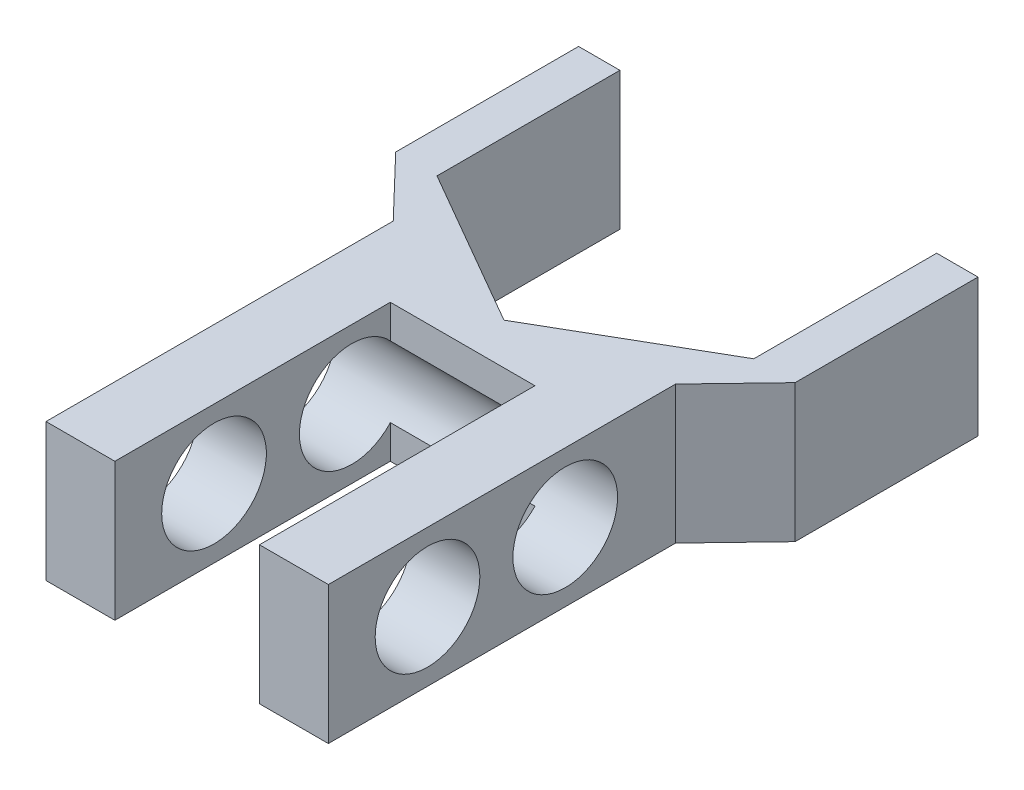
ISO-10303-21;
HEADER;
FILE_DESCRIPTION(('STEP AP214'),'2;1');
FILE_NAME('part.step','',(''),(''),'','','');
FILE_SCHEMA(('AUTOMOTIVE_DESIGN { 1 0 10303 214 1 1 1 1 }'));
ENDSEC;
DATA;
#1=APPLICATION_CONTEXT('core data for automotive mechanical design processes');
#2=APPLICATION_PROTOCOL_DEFINITION('international standard','automotive_design',2000,#1);
#3=PRODUCT_CONTEXT('',#1,'mechanical');
#4=PRODUCT('Part','Part','',(#3));
#5=PRODUCT_RELATED_PRODUCT_CATEGORY('part','',(#4));
#6=PRODUCT_DEFINITION_FORMATION('','',#4);
#7=PRODUCT_DEFINITION_CONTEXT('part definition',#1,'design');
#8=PRODUCT_DEFINITION('design','',#6,#7);
#9=PRODUCT_DEFINITION_SHAPE('','',#8);
#10=(LENGTH_UNIT() NAMED_UNIT(*) SI_UNIT(.MILLI.,.METRE.));
#11=(NAMED_UNIT(*) PLANE_ANGLE_UNIT() SI_UNIT($,.RADIAN.));
#12=(NAMED_UNIT(*) SI_UNIT($,.STERADIAN.) SOLID_ANGLE_UNIT());
#13=UNCERTAINTY_MEASURE_WITH_UNIT(LENGTH_MEASURE(1.E-05),#10,'distance_accuracy_value','');
#14=(GEOMETRIC_REPRESENTATION_CONTEXT(3) GLOBAL_UNCERTAINTY_ASSIGNED_CONTEXT((#13)) GLOBAL_UNIT_ASSIGNED_CONTEXT((#10,
#11,#12)) REPRESENTATION_CONTEXT('',''));
#15=CARTESIAN_POINT('',(0.,0.,0.));
#16=DIRECTION('',(0.,0.,1.));
#17=DIRECTION('',(1.,0.,0.));
#18=AXIS2_PLACEMENT_3D('',#15,#16,#17);
#19=CARTESIAN_POINT('',(0.,10.,16.2790561913614));
#20=DIRECTION('',(0.,0.,-1.));
#21=DIRECTION('',(-1.,0.,0.));
#22=AXIS2_PLACEMENT_3D('',#19,#20,#21);
#23=PLANE('',#22);
#24=DIRECTION('',(0.,-1.,0.));
#25=VECTOR('',#24,1.);
#26=CARTESIAN_POINT('',(5.25,10.,16.2790561913614));
#27=LINE('',#26,#25);
#28=CARTESIAN_POINT('',(5.25,2.43095348426698,16.2790561913614));
#29=VERTEX_POINT('',#28);
#30=CARTESIAN_POINT('',(5.25,0.,16.2790561913614));
#31=VERTEX_POINT('',#30);
#32=EDGE_CURVE('E297',#29,#31,#27,.T.);
#33=ORIENTED_EDGE('',*,*,#32,.F.);
#34=DIRECTION('',(-1.,0.,0.));
#35=VECTOR('',#34,1.);
#36=CARTESIAN_POINT('',(14.5,2.43095348426698,16.2790561913614));
#37=LINE('',#36,#35);
#38=CARTESIAN_POINT('',(-5.25,2.43095348426698,16.2790561913614));
#39=VERTEX_POINT('',#38);
#40=EDGE_CURVE('E65',#29,#39,#37,.T.);
#41=ORIENTED_EDGE('',*,*,#40,.T.);
#42=DIRECTION('',(0.,-1.,0.));
#43=VECTOR('',#42,1.);
#44=CARTESIAN_POINT('',(-5.25,10.,16.2790561913614));
#45=LINE('',#44,#43);
#46=CARTESIAN_POINT('',(-5.25,0.,16.2790561913614));
#47=VERTEX_POINT('',#46);
#48=EDGE_CURVE('E302',#39,#47,#45,.T.);
#49=ORIENTED_EDGE('',*,*,#48,.T.);
#50=DIRECTION('',(1.,0.,0.));
#51=VECTOR('',#50,1.);
#52=CARTESIAN_POINT('',(0.,0.,16.2790561913614));
#53=LINE('',#52,#51);
#54=EDGE_CURVE('E238',#47,#31,#53,.T.);
#55=ORIENTED_EDGE('',*,*,#54,.T.);
#56=EDGE_LOOP('',(#33,#41,#49,#55));
#57=FACE_BOUND('',#56,.T.);
#58=ADVANCED_FACE('F47',(#57),#23,.F.);
#59=CARTESIAN_POINT('',(-11.5,10.,0.));
#60=DIRECTION('',(1.,0.,0.));
#61=DIRECTION('',(0.,0.,-1.));
#62=AXIS2_PLACEMENT_3D('',#59,#60,#61);
#63=PLANE('',#62);
#64=DIRECTION('',(0.,0.,1.));
#65=VECTOR('',#64,1.);
#66=CARTESIAN_POINT('',(-11.5,0.,0.));
#67=LINE('',#66,#65);
#68=CARTESIAN_POINT('',(-11.5,0.,-6.63952809568069));
#69=VERTEX_POINT('',#68);
#70=CARTESIAN_POINT('',(-11.5,0.,6.6395280956807));
#71=VERTEX_POINT('',#70);
#72=EDGE_CURVE('E215',#69,#71,#67,.T.);
#73=ORIENTED_EDGE('',*,*,#72,.F.);
#74=DIRECTION('',(0.,-1.,0.));
#75=VECTOR('',#74,1.);
#76=CARTESIAN_POINT('',(-11.5,10.,-6.63952809568069));
#77=LINE('',#76,#75);
#78=CARTESIAN_POINT('',(-11.5,10.,-6.63952809568069));
#79=VERTEX_POINT('',#78);
#80=EDGE_CURVE('E11',#79,#69,#77,.T.);
#81=ORIENTED_EDGE('',*,*,#80,.F.);
#82=DIRECTION('',(0.,0.,1.));
#83=VECTOR('',#82,1.);
#84=CARTESIAN_POINT('',(-11.5,10.,0.));
#85=LINE('',#84,#83);
#86=CARTESIAN_POINT('',(-11.5,10.,6.6395280956807));
#87=VERTEX_POINT('',#86);
#88=EDGE_CURVE('E275',#79,#87,#85,.T.);
#89=ORIENTED_EDGE('',*,*,#88,.T.);
#90=DIRECTION('',(0.,-1.,0.));
#91=VECTOR('',#90,1.);
#92=CARTESIAN_POINT('',(-11.5,10.,6.6395280956807));
#93=LINE('',#92,#91);
#94=EDGE_CURVE('E74',#87,#71,#93,.T.);
#95=ORIENTED_EDGE('',*,*,#94,.T.);
#96=EDGE_LOOP('',(#73,#81,#89,#95));
#97=FACE_BOUND('',#96,.T.);
#98=ADVANCED_FACE('F49',(#97),#63,.T.);
#99=CARTESIAN_POINT('',(0.,10.,-6.63952809568067));
#100=DIRECTION('',(0.,0.,1.));
#101=DIRECTION('',(1.,0.,0.));
#102=AXIS2_PLACEMENT_3D('',#99,#100,#101);
#103=PLANE('',#102);
#104=DIRECTION('',(-1.,0.,0.));
#105=VECTOR('',#104,1.);
#106=CARTESIAN_POINT('',(0.,0.,-6.63952809568067));
#107=LINE('',#106,#105);
#108=CARTESIAN_POINT('',(-14.5,0.,-6.63952809568069));
#109=VERTEX_POINT('',#108);
#110=EDGE_CURVE('E218',#69,#109,#107,.T.);
#111=ORIENTED_EDGE('',*,*,#110,.T.);
#112=DIRECTION('',(0.,-1.,0.));
#113=VECTOR('',#112,1.);
#114=CARTESIAN_POINT('',(-14.5,10.,-6.63952809568069));
#115=LINE('',#114,#113);
#116=CARTESIAN_POINT('',(-14.5,10.,-6.63952809568069));
#117=VERTEX_POINT('',#116);
#118=EDGE_CURVE('E57',#117,#109,#115,.T.);
#119=ORIENTED_EDGE('',*,*,#118,.F.);
#120=DIRECTION('',(-1.,0.,0.));
#121=VECTOR('',#120,1.);
#122=CARTESIAN_POINT('',(0.,10.,-6.63952809568067));
#123=LINE('',#122,#121);
#124=EDGE_CURVE('E363',#79,#117,#123,.T.);
#125=ORIENTED_EDGE('',*,*,#124,.F.);
#126=ORIENTED_EDGE('',*,*,#80,.T.);
#127=EDGE_LOOP('',(#111,#119,#125,#126));
#128=FACE_BOUND('',#127,.T.);
#129=ADVANCED_FACE('F413',(#128),#103,.F.);
#130=CARTESIAN_POINT('',(-14.5,10.,0.));
#131=DIRECTION('',(1.,0.,0.));
#132=DIRECTION('',(0.,0.,-1.));
#133=AXIS2_PLACEMENT_3D('',#130,#131,#132);
#134=PLANE('',#133);
#135=DIRECTION('',(0.,0.,1.));
#136=VECTOR('',#135,1.);
#137=CARTESIAN_POINT('',(-14.5,0.,0.));
#138=LINE('',#137,#136);
#139=CARTESIAN_POINT('',(-14.5,0.,6.6395280956807));
#140=VERTEX_POINT('',#139);
#141=EDGE_CURVE('E222',#109,#140,#138,.T.);
#142=ORIENTED_EDGE('',*,*,#141,.T.);
#143=DIRECTION('',(0.,-1.,0.));
#144=VECTOR('',#143,1.);
#145=CARTESIAN_POINT('',(-14.5,10.,6.6395280956807));
#146=LINE('',#145,#144);
#147=CARTESIAN_POINT('',(-14.5,10.,6.6395280956807));
#148=VERTEX_POINT('',#147);
#149=EDGE_CURVE('E319',#148,#140,#146,.T.);
#150=ORIENTED_EDGE('',*,*,#149,.F.);
#151=DIRECTION('',(0.,0.,1.));
#152=VECTOR('',#151,1.);
#153=CARTESIAN_POINT('',(-14.5,10.,0.));
#154=LINE('',#153,#152);
#155=EDGE_CURVE('E366',#117,#148,#154,.T.);
#156=ORIENTED_EDGE('',*,*,#155,.F.);
#157=ORIENTED_EDGE('',*,*,#118,.T.);
#158=EDGE_LOOP('',(#142,#150,#156,#157));
#159=FACE_BOUND('',#158,.T.);
#160=ADVANCED_FACE('F417',(#159),#134,.F.);
#161=CARTESIAN_POINT('',(-10.8658247279593,10.,10.4267426512985));
#162=DIRECTION('',(0.721534900393805,0.,-0.692378066892433));
#163=DIRECTION('',(-0.692378066892433,0.,-0.721534900393805));
#164=AXIS2_PLACEMENT_3D('',#161,#162,#163);
#165=PLANE('',#164);
#166=DIRECTION('',(0.692378066892433,0.,0.721534900393805));
#167=VECTOR('',#166,1.);
#168=CARTESIAN_POINT('',(-10.8658247279593,0.,10.4267426512985));
#169=LINE('',#168,#167);
#170=CARTESIAN_POINT('',(-10.25,0.,11.0685004639664));
#171=VERTEX_POINT('',#170);
#172=EDGE_CURVE('E225',#140,#171,#169,.T.);
#173=ORIENTED_EDGE('',*,*,#172,.T.);
#174=DIRECTION('',(0.,-1.,0.));
#175=VECTOR('',#174,1.);
#176=CARTESIAN_POINT('',(-10.25,10.,11.0685004639664));
#177=LINE('',#176,#175);
#178=CARTESIAN_POINT('',(-10.25,10.,11.0685004639664));
#179=VERTEX_POINT('',#178);
#180=EDGE_CURVE('E315',#179,#171,#177,.T.);
#181=ORIENTED_EDGE('',*,*,#180,.F.);
#182=DIRECTION('',(0.692378066892433,0.,0.721534900393805));
#183=VECTOR('',#182,1.);
#184=CARTESIAN_POINT('',(-10.8658247279593,10.,10.4267426512985));
#185=LINE('',#184,#183);
#186=EDGE_CURVE('E369',#148,#179,#185,.T.);
#187=ORIENTED_EDGE('',*,*,#186,.F.);
#188=ORIENTED_EDGE('',*,*,#149,.T.);
#189=EDGE_LOOP('',(#173,#181,#187,#188));
#190=FACE_BOUND('',#189,.T.);
#191=ADVANCED_FACE('F487',(#190),#165,.F.);
#192=CARTESIAN_POINT('',(-10.25,10.,0.));
#193=DIRECTION('',(1.,0.,0.));
#194=DIRECTION('',(0.,0.,-1.));
#195=AXIS2_PLACEMENT_3D('',#192,#193,#194);
#196=PLANE('',#195);
#197=CARTESIAN_POINT('',(-10.25,5.,19.0790561913614));
#198=DIRECTION('',(-1.,0.,0.));
#199=DIRECTION('',(0.,0.,1.));
#200=AXIS2_PLACEMENT_3D('',#197,#198,#199);
#201=CIRCLE('',#200,3.8);
#202=CARTESIAN_POINT('',(-10.25,5.,22.8790561913614));
#203=VERTEX_POINT('',#202);
#204=EDGE_CURVE('E329',#203,#203,#201,.T.);
#205=ORIENTED_EDGE('',*,*,#204,.F.);
#206=EDGE_LOOP('',(#205));
#207=FACE_BOUND('',#206,.T.);
#208=CARTESIAN_POINT('',(-10.25,5.,29.0790561913614));
#209=DIRECTION('',(-1.,0.,0.));
#210=DIRECTION('',(0.,0.,1.));
#211=AXIS2_PLACEMENT_3D('',#208,#209,#210);
#212=CIRCLE('',#211,3.8);
#213=CARTESIAN_POINT('',(-10.25,5.,32.8790561913614));
#214=VERTEX_POINT('',#213);
#215=EDGE_CURVE('E338',#214,#214,#212,.T.);
#216=ORIENTED_EDGE('',*,*,#215,.F.);
#217=EDGE_LOOP('',(#216));
#218=FACE_BOUND('',#217,.T.);
#219=DIRECTION('',(0.,0.,1.));
#220=VECTOR('',#219,1.);
#221=CARTESIAN_POINT('',(-10.25,0.,0.));
#222=LINE('',#221,#220);
#223=CARTESIAN_POINT('',(-10.25,0.,36.2790561913614));
#224=VERTEX_POINT('',#223);
#225=EDGE_CURVE('E228',#171,#224,#222,.T.);
#226=ORIENTED_EDGE('',*,*,#225,.T.);
#227=DIRECTION('',(0.,-1.,0.));
#228=VECTOR('',#227,1.);
#229=CARTESIAN_POINT('',(-10.25,10.,36.2790561913614));
#230=LINE('',#229,#228);
#231=CARTESIAN_POINT('',(-10.25,10.,36.2790561913614));
#232=VERTEX_POINT('',#231);
#233=EDGE_CURVE('E311',#232,#224,#230,.T.);
#234=ORIENTED_EDGE('',*,*,#233,.F.);
#235=DIRECTION('',(0.,0.,1.));
#236=VECTOR('',#235,1.);
#237=CARTESIAN_POINT('',(-10.25,10.,0.));
#238=LINE('',#237,#236);
#239=EDGE_CURVE('E372',#179,#232,#238,.T.);
#240=ORIENTED_EDGE('',*,*,#239,.F.);
#241=ORIENTED_EDGE('',*,*,#180,.T.);
#242=EDGE_LOOP('',(#226,#234,#240,#241));
#243=FACE_BOUND('',#242,.T.);
#244=ADVANCED_FACE('F482',(#207,#218,#243),#196,.F.);
#245=CARTESIAN_POINT('',(0.,10.,36.2790561913614));
#246=DIRECTION('',(0.,0.,-1.));
#247=DIRECTION('',(-1.,0.,0.));
#248=AXIS2_PLACEMENT_3D('',#245,#246,#247);
#249=PLANE('',#248);
#250=DIRECTION('',(1.,0.,0.));
#251=VECTOR('',#250,1.);
#252=CARTESIAN_POINT('',(0.,0.,36.2790561913614));
#253=LINE('',#252,#251);
#254=CARTESIAN_POINT('',(-5.25,0.,36.2790561913614));
#255=VERTEX_POINT('',#254);
#256=EDGE_CURVE('E231',#224,#255,#253,.T.);
#257=ORIENTED_EDGE('',*,*,#256,.T.);
#258=DIRECTION('',(0.,-1.,0.));
#259=VECTOR('',#258,1.);
#260=CARTESIAN_POINT('',(-5.25,10.,36.2790561913614));
#261=LINE('',#260,#259);
#262=CARTESIAN_POINT('',(-5.25,10.,36.2790561913614));
#263=VERTEX_POINT('',#262);
#264=EDGE_CURVE('E307',#263,#255,#261,.T.);
#265=ORIENTED_EDGE('',*,*,#264,.F.);
#266=DIRECTION('',(1.,0.,0.));
#267=VECTOR('',#266,1.);
#268=CARTESIAN_POINT('',(0.,10.,36.2790561913614));
#269=LINE('',#268,#267);
#270=EDGE_CURVE('E375',#232,#263,#269,.T.);
#271=ORIENTED_EDGE('',*,*,#270,.F.);
#272=ORIENTED_EDGE('',*,*,#233,.T.);
#273=EDGE_LOOP('',(#257,#265,#271,#272));
#274=FACE_BOUND('',#273,.T.);
#275=ADVANCED_FACE('F440',(#274),#249,.F.);
#276=CARTESIAN_POINT('',(-5.25,10.,0.));
#277=DIRECTION('',(-1.,0.,0.));
#278=DIRECTION('',(0.,0.,1.));
#279=AXIS2_PLACEMENT_3D('',#276,#277,#278);
#280=PLANE('',#279);
#281=CARTESIAN_POINT('',(-5.25,5.,29.0790561913614));
#282=DIRECTION('',(-1.,0.,0.));
#283=DIRECTION('',(0.,0.,1.));
#284=AXIS2_PLACEMENT_3D('',#281,#282,#283);
#285=CIRCLE('',#284,3.8);
#286=CARTESIAN_POINT('',(-5.25,5.,32.8790561913614));
#287=VERTEX_POINT('',#286);
#288=EDGE_CURVE('E335',#287,#287,#285,.T.);
#289=ORIENTED_EDGE('',*,*,#288,.T.);
#290=EDGE_LOOP('',(#289));
#291=FACE_BOUND('',#290,.T.);
#292=ORIENTED_EDGE('',*,*,#48,.F.);
#293=CARTESIAN_POINT('',(-5.25,5.,19.0790561913614));
#294=DIRECTION('',(-1.,0.,0.));
#295=DIRECTION('',(0.,0.,1.));
#296=AXIS2_PLACEMENT_3D('',#293,#294,#295);
#297=CIRCLE('',#296,3.8);
#298=CARTESIAN_POINT('',(-5.25,7.56904651573303,16.2790561913614));
#299=VERTEX_POINT('',#298);
#300=EDGE_CURVE('E219',#39,#299,#297,.T.);
#301=ORIENTED_EDGE('',*,*,#300,.T.);
#302=CARTESIAN_POINT('',(-5.25,10.,16.2790561913614));
#303=VERTEX_POINT('',#302);
#304=EDGE_CURVE('E303',#303,#299,#45,.T.);
#305=ORIENTED_EDGE('',*,*,#304,.F.);
#306=DIRECTION('',(0.,0.,-1.));
#307=VECTOR('',#306,1.);
#308=CARTESIAN_POINT('',(-5.25,10.,0.));
#309=LINE('',#308,#307);
#310=EDGE_CURVE('E378',#263,#303,#309,.T.);
#311=ORIENTED_EDGE('',*,*,#310,.F.);
#312=ORIENTED_EDGE('',*,*,#264,.T.);
#313=DIRECTION('',(0.,0.,-1.));
#314=VECTOR('',#313,1.);
#315=CARTESIAN_POINT('',(-5.25,0.,0.));
#316=LINE('',#315,#314);
#317=EDGE_CURVE('E234',#255,#47,#316,.T.);
#318=ORIENTED_EDGE('',*,*,#317,.T.);
#319=EDGE_LOOP('',(#292,#301,#305,#311,#312,#318));
#320=FACE_BOUND('',#319,.T.);
#321=ADVANCED_FACE('F432',(#291,#320),#280,.F.);
#322=ORIENTED_EDGE('',*,*,#304,.T.);
#323=DIRECTION('',(-1.,0.,0.));
#324=VECTOR('',#323,1.);
#325=CARTESIAN_POINT('',(14.5,7.56904651573303,16.2790561913614));
#326=LINE('',#325,#324);
#327=CARTESIAN_POINT('',(5.25,7.56904651573303,16.2790561913614));
#328=VERTEX_POINT('',#327);
#329=EDGE_CURVE('E352',#299,#328,#326,.F.);
#330=ORIENTED_EDGE('',*,*,#329,.T.);
#331=CARTESIAN_POINT('',(5.25,10.,16.2790561913614));
#332=VERTEX_POINT('',#331);
#333=EDGE_CURVE('E298',#332,#328,#27,.T.);
#334=ORIENTED_EDGE('',*,*,#333,.F.);
#335=DIRECTION('',(1.,0.,0.));
#336=VECTOR('',#335,1.);
#337=CARTESIAN_POINT('',(0.,10.,16.2790561913614));
#338=LINE('',#337,#336);
#339=EDGE_CURVE('E381',#303,#332,#338,.T.);
#340=ORIENTED_EDGE('',*,*,#339,.F.);
#341=EDGE_LOOP('',(#322,#330,#334,#340));
#342=FACE_BOUND('',#341,.T.);
#343=ADVANCED_FACE('F422',(#342),#23,.F.);
#344=CARTESIAN_POINT('',(5.25,10.,0.));
#345=DIRECTION('',(-1.,0.,0.));
#346=DIRECTION('',(0.,0.,1.));
#347=AXIS2_PLACEMENT_3D('',#344,#345,#346);
#348=PLANE('',#347);
#349=CARTESIAN_POINT('',(5.25,5.,19.0790561913614));
#350=DIRECTION('',(-1.,0.,0.));
#351=DIRECTION('',(0.,0.,1.));
#352=AXIS2_PLACEMENT_3D('',#349,#350,#351);
#353=CIRCLE('',#352,3.8);
#354=EDGE_CURVE('E349',#29,#328,#353,.T.);
#355=ORIENTED_EDGE('',*,*,#354,.F.);
#356=ORIENTED_EDGE('',*,*,#32,.T.);
#357=DIRECTION('',(0.,0.,-1.));
#358=VECTOR('',#357,1.);
#359=CARTESIAN_POINT('',(5.25,0.,0.));
#360=LINE('',#359,#358);
#361=CARTESIAN_POINT('',(5.25,0.,36.2790561913614));
#362=VERTEX_POINT('',#361);
#363=EDGE_CURVE('E242',#362,#31,#360,.T.);
#364=ORIENTED_EDGE('',*,*,#363,.F.);
#365=DIRECTION('',(0.,-1.,0.));
#366=VECTOR('',#365,1.);
#367=CARTESIAN_POINT('',(5.25,10.,36.2790561913614));
#368=LINE('',#367,#366);
#369=CARTESIAN_POINT('',(5.25,10.,36.2790561913614));
#370=VERTEX_POINT('',#369);
#371=EDGE_CURVE('E294',#370,#362,#368,.T.);
#372=ORIENTED_EDGE('',*,*,#371,.F.);
#373=DIRECTION('',(0.,0.,-1.));
#374=VECTOR('',#373,1.);
#375=CARTESIAN_POINT('',(5.25,10.,0.));
#376=LINE('',#375,#374);
#377=EDGE_CURVE('E384',#370,#332,#376,.T.);
#378=ORIENTED_EDGE('',*,*,#377,.T.);
#379=ORIENTED_EDGE('',*,*,#333,.T.);
#380=EDGE_LOOP('',(#355,#356,#364,#372,#378,#379));
#381=FACE_BOUND('',#380,.T.);
#382=CARTESIAN_POINT('',(5.25,5.,29.0790561913614));
#383=DIRECTION('',(-1.,0.,0.));
#384=DIRECTION('',(0.,0.,1.));
#385=AXIS2_PLACEMENT_3D('',#382,#383,#384);
#386=CIRCLE('',#385,3.8);
#387=CARTESIAN_POINT('',(5.25,5.,32.8790561913614));
#388=VERTEX_POINT('',#387);
#389=EDGE_CURVE('E328',#388,#388,#386,.T.);
#390=ORIENTED_EDGE('',*,*,#389,.F.);
#391=EDGE_LOOP('',(#390));
#392=FACE_BOUND('',#391,.T.);
#393=ADVANCED_FACE('F431',(#381,#392),#348,.T.);
#394=CARTESIAN_POINT('',(0.,10.,36.2790561913614));
#395=DIRECTION('',(0.,0.,1.));
#396=DIRECTION('',(1.,0.,0.));
#397=AXIS2_PLACEMENT_3D('',#394,#395,#396);
#398=PLANE('',#397);
#399=DIRECTION('',(-1.,0.,0.));
#400=VECTOR('',#399,1.);
#401=CARTESIAN_POINT('',(0.,0.,36.2790561913614));
#402=LINE('',#401,#400);
#403=CARTESIAN_POINT('',(10.25,0.,36.2790561913614));
#404=VERTEX_POINT('',#403);
#405=EDGE_CURVE('E246',#404,#362,#402,.T.);
#406=ORIENTED_EDGE('',*,*,#405,.F.);
#407=DIRECTION('',(0.,-1.,0.));
#408=VECTOR('',#407,1.);
#409=CARTESIAN_POINT('',(10.25,10.,36.2790561913614));
#410=LINE('',#409,#408);
#411=CARTESIAN_POINT('',(10.25,10.,36.2790561913614));
#412=VERTEX_POINT('',#411);
#413=EDGE_CURVE('E291',#412,#404,#410,.T.);
#414=ORIENTED_EDGE('',*,*,#413,.F.);
#415=DIRECTION('',(-1.,0.,0.));
#416=VECTOR('',#415,1.);
#417=CARTESIAN_POINT('',(0.,10.,36.2790561913614));
#418=LINE('',#417,#416);
#419=EDGE_CURVE('E388',#412,#370,#418,.T.);
#420=ORIENTED_EDGE('',*,*,#419,.T.);
#421=ORIENTED_EDGE('',*,*,#371,.T.);
#422=EDGE_LOOP('',(#406,#414,#420,#421));
#423=FACE_BOUND('',#422,.T.);
#424=ADVANCED_FACE('F438',(#423),#398,.T.);
#425=CARTESIAN_POINT('',(10.25,10.,0.));
#426=DIRECTION('',(1.,0.,0.));
#427=DIRECTION('',(0.,0.,-1.));
#428=AXIS2_PLACEMENT_3D('',#425,#426,#427);
#429=PLANE('',#428);
#430=CARTESIAN_POINT('',(10.25,5.,19.0790561913614));
#431=DIRECTION('',(1.,0.,0.));
#432=DIRECTION('',(0.,0.,-1.));
#433=AXIS2_PLACEMENT_3D('',#430,#431,#432);
#434=CIRCLE('',#433,3.8);
#435=CARTESIAN_POINT('',(10.25,5.,15.2790561913614));
#436=VERTEX_POINT('',#435);
#437=EDGE_CURVE('E51',#436,#436,#434,.T.);
#438=ORIENTED_EDGE('',*,*,#437,.F.);
#439=EDGE_LOOP('',(#438));
#440=FACE_BOUND('',#439,.T.);
#441=CARTESIAN_POINT('',(10.25,5.,29.0790561913614));
#442=DIRECTION('',(1.,0.,0.));
#443=DIRECTION('',(0.,0.,-1.));
#444=AXIS2_PLACEMENT_3D('',#441,#442,#443);
#445=CIRCLE('',#444,3.8);
#446=CARTESIAN_POINT('',(10.25,5.,25.2790561913614));
#447=VERTEX_POINT('',#446);
#448=EDGE_CURVE('E325',#447,#447,#445,.T.);
#449=ORIENTED_EDGE('',*,*,#448,.F.);
#450=EDGE_LOOP('',(#449));
#451=FACE_BOUND('',#450,.T.);
#452=DIRECTION('',(0.,0.,1.));
#453=VECTOR('',#452,1.);
#454=CARTESIAN_POINT('',(10.25,0.,0.));
#455=LINE('',#454,#453);
#456=CARTESIAN_POINT('',(10.25,0.,11.0685004639664));
#457=VERTEX_POINT('',#456);
#458=EDGE_CURVE('E250',#457,#404,#455,.T.);
#459=ORIENTED_EDGE('',*,*,#458,.F.);
#460=DIRECTION('',(0.,-1.,0.));
#461=VECTOR('',#460,1.);
#462=CARTESIAN_POINT('',(10.25,10.,11.0685004639664));
#463=LINE('',#462,#461);
#464=CARTESIAN_POINT('',(10.25,10.,11.0685004639664));
#465=VERTEX_POINT('',#464);
#466=EDGE_CURVE('E288',#465,#457,#463,.T.);
#467=ORIENTED_EDGE('',*,*,#466,.F.);
#468=DIRECTION('',(0.,0.,1.));
#469=VECTOR('',#468,1.);
#470=CARTESIAN_POINT('',(10.25,10.,0.));
#471=LINE('',#470,#469);
#472=EDGE_CURVE('E392',#465,#412,#471,.T.);
#473=ORIENTED_EDGE('',*,*,#472,.T.);
#474=ORIENTED_EDGE('',*,*,#413,.T.);
#475=EDGE_LOOP('',(#459,#467,#473,#474));
#476=FACE_BOUND('',#475,.T.);
#477=ADVANCED_FACE('F465',(#440,#451,#476),#429,.T.);
#478=CARTESIAN_POINT('',(10.8658247279593,10.,10.4267426512984));
#479=DIRECTION('',(-0.721534900393805,0.,-0.692378066892432));
#480=DIRECTION('',(-0.692378066892432,0.,0.721534900393805));
#481=AXIS2_PLACEMENT_3D('',#478,#479,#480);
#482=PLANE('',#481);
#483=DIRECTION('',(0.692378066892433,0.,-0.721534900393805));
#484=VECTOR('',#483,1.);
#485=CARTESIAN_POINT('',(10.8658247279593,0.,10.4267426512984));
#486=LINE('',#485,#484);
#487=CARTESIAN_POINT('',(14.5,0.,6.63952809568069));
#488=VERTEX_POINT('',#487);
#489=EDGE_CURVE('E254',#457,#488,#486,.T.);
#490=ORIENTED_EDGE('',*,*,#489,.T.);
#491=DIRECTION('',(0.,-1.,0.));
#492=VECTOR('',#491,1.);
#493=CARTESIAN_POINT('',(14.5,10.,6.63952809568069));
#494=LINE('',#493,#492);
#495=CARTESIAN_POINT('',(14.5,10.,6.63952809568069));
#496=VERTEX_POINT('',#495);
#497=EDGE_CURVE('E285',#496,#488,#494,.T.);
#498=ORIENTED_EDGE('',*,*,#497,.F.);
#499=DIRECTION('',(0.692378066892433,0.,-0.721534900393805));
#500=VECTOR('',#499,1.);
#501=CARTESIAN_POINT('',(10.8658247279593,10.,10.4267426512984));
#502=LINE('',#501,#500);
#503=EDGE_CURVE('E396',#465,#496,#502,.T.);
#504=ORIENTED_EDGE('',*,*,#503,.F.);
#505=ORIENTED_EDGE('',*,*,#466,.T.);
#506=EDGE_LOOP('',(#490,#498,#504,#505));
#507=FACE_BOUND('',#506,.T.);
#508=ADVANCED_FACE('F469',(#507),#482,.F.);
#509=CARTESIAN_POINT('',(14.5,10.,0.));
#510=DIRECTION('',(1.,0.,0.));
#511=DIRECTION('',(0.,0.,-1.));
#512=AXIS2_PLACEMENT_3D('',#509,#510,#511);
#513=PLANE('',#512);
#514=DIRECTION('',(0.,0.,1.));
#515=VECTOR('',#514,1.);
#516=CARTESIAN_POINT('',(14.5,0.,0.));
#517=LINE('',#516,#515);
#518=CARTESIAN_POINT('',(14.5,0.,-6.6395280956807));
#519=VERTEX_POINT('',#518);
#520=EDGE_CURVE('E258',#519,#488,#517,.T.);
#521=ORIENTED_EDGE('',*,*,#520,.F.);
#522=DIRECTION('',(0.,-1.,0.));
#523=VECTOR('',#522,1.);
#524=CARTESIAN_POINT('',(14.5,10.,-6.6395280956807));
#525=LINE('',#524,#523);
#526=CARTESIAN_POINT('',(14.5,10.,-6.6395280956807));
#527=VERTEX_POINT('',#526);
#528=EDGE_CURVE('E282',#527,#519,#525,.T.);
#529=ORIENTED_EDGE('',*,*,#528,.F.);
#530=DIRECTION('',(0.,0.,1.));
#531=VECTOR('',#530,1.);
#532=CARTESIAN_POINT('',(14.5,10.,0.));
#533=LINE('',#532,#531);
#534=EDGE_CURVE('E399',#527,#496,#533,.T.);
#535=ORIENTED_EDGE('',*,*,#534,.T.);
#536=ORIENTED_EDGE('',*,*,#497,.T.);
#537=EDGE_LOOP('',(#521,#529,#535,#536));
#538=FACE_BOUND('',#537,.T.);
#539=ADVANCED_FACE('F472',(#538),#513,.T.);
#540=CARTESIAN_POINT('',(0.,10.,-6.63952809568068));
#541=DIRECTION('',(0.,0.,-1.));
#542=DIRECTION('',(-1.,0.,0.));
#543=AXIS2_PLACEMENT_3D('',#540,#541,#542);
#544=PLANE('',#543);
#545=DIRECTION('',(1.,0.,0.));
#546=VECTOR('',#545,1.);
#547=CARTESIAN_POINT('',(0.,0.,-6.63952809568068));
#548=LINE('',#547,#546);
#549=CARTESIAN_POINT('',(11.5,0.,-6.6395280956807));
#550=VERTEX_POINT('',#549);
#551=EDGE_CURVE('E262',#550,#519,#548,.T.);
#552=ORIENTED_EDGE('',*,*,#551,.F.);
#553=DIRECTION('',(0.,-1.,0.));
#554=VECTOR('',#553,1.);
#555=CARTESIAN_POINT('',(11.5,10.,-6.6395280956807));
#556=LINE('',#555,#554);
#557=CARTESIAN_POINT('',(11.5,10.,-6.6395280956807));
#558=VERTEX_POINT('',#557);
#559=EDGE_CURVE('E192',#558,#550,#556,.T.);
#560=ORIENTED_EDGE('',*,*,#559,.F.);
#561=DIRECTION('',(1.,0.,0.));
#562=VECTOR('',#561,1.);
#563=CARTESIAN_POINT('',(0.,10.,-6.63952809568068));
#564=LINE('',#563,#562);
#565=EDGE_CURVE('E204',#558,#527,#564,.T.);
#566=ORIENTED_EDGE('',*,*,#565,.T.);
#567=ORIENTED_EDGE('',*,*,#528,.T.);
#568=EDGE_LOOP('',(#552,#560,#566,#567));
#569=FACE_BOUND('',#568,.T.);
#570=ADVANCED_FACE('F405',(#569),#544,.T.);
#571=CARTESIAN_POINT('',(11.5,10.,0.));
#572=DIRECTION('',(-1.,0.,0.));
#573=DIRECTION('',(0.,0.,1.));
#574=AXIS2_PLACEMENT_3D('',#571,#572,#573);
#575=PLANE('',#574);
#576=DIRECTION('',(0.,0.,-1.));
#577=VECTOR('',#576,1.);
#578=CARTESIAN_POINT('',(11.5,0.,0.));
#579=LINE('',#578,#577);
#580=CARTESIAN_POINT('',(11.5,0.,6.63952809568069));
#581=VERTEX_POINT('',#580);
#582=EDGE_CURVE('E186',#581,#550,#579,.T.);
#583=ORIENTED_EDGE('',*,*,#582,.F.);
#584=DIRECTION('',(0.,-1.,0.));
#585=VECTOR('',#584,1.);
#586=CARTESIAN_POINT('',(11.5,10.,6.63952809568069));
#587=LINE('',#586,#585);
#588=CARTESIAN_POINT('',(11.5,10.,6.63952809568069));
#589=VERTEX_POINT('',#588);
#590=EDGE_CURVE('E181',#589,#581,#587,.T.);
#591=ORIENTED_EDGE('',*,*,#590,.F.);
#592=DIRECTION('',(0.,0.,-1.));
#593=VECTOR('',#592,1.);
#594=CARTESIAN_POINT('',(11.5,10.,0.));
#595=LINE('',#594,#593);
#596=EDGE_CURVE('E184',#589,#558,#595,.T.);
#597=ORIENTED_EDGE('',*,*,#596,.T.);
#598=ORIENTED_EDGE('',*,*,#559,.T.);
#599=EDGE_LOOP('',(#583,#591,#597,#598));
#600=FACE_BOUND('',#599,.T.);
#601=ADVANCED_FACE('F183',(#600),#575,.T.);
#602=CARTESIAN_POINT('',(5.75,10.,9.95929214352104));
#603=DIRECTION('',(-0.5,0.,-0.866025403784438));
#604=DIRECTION('',(-0.866025403784438,0.,0.5));
#605=AXIS2_PLACEMENT_3D('',#602,#603,#604);
#606=PLANE('',#605);
#607=DIRECTION('',(0.866025403784438,0.,-0.5));
#608=VECTOR('',#607,1.);
#609=CARTESIAN_POINT('',(5.75,0.,9.95929214352104));
#610=LINE('',#609,#608);
#611=CARTESIAN_POINT('',(0.,0.,13.2790561913614));
#612=VERTEX_POINT('',#611);
#613=EDGE_CURVE('E268',#612,#581,#610,.T.);
#614=ORIENTED_EDGE('',*,*,#613,.F.);
#615=DIRECTION('',(0.,-1.,0.));
#616=VECTOR('',#615,1.);
#617=CARTESIAN_POINT('',(0.,10.,13.2790561913614));
#618=LINE('',#617,#616);
#619=CARTESIAN_POINT('',(0.,10.,13.2790561913614));
#620=VERTEX_POINT('',#619);
#621=EDGE_CURVE('E193',#620,#612,#618,.T.);
#622=ORIENTED_EDGE('',*,*,#621,.F.);
#623=DIRECTION('',(0.866025403784438,0.,-0.5));
#624=VECTOR('',#623,1.);
#625=CARTESIAN_POINT('',(5.75,10.,9.95929214352104));
#626=LINE('',#625,#624);
#627=EDGE_CURVE('E201',#620,#589,#626,.T.);
#628=ORIENTED_EDGE('',*,*,#627,.T.);
#629=ORIENTED_EDGE('',*,*,#590,.T.);
#630=EDGE_LOOP('',(#614,#622,#628,#629));
#631=FACE_BOUND('',#630,.T.);
#632=ADVANCED_FACE('F207',(#631),#606,.T.);
#633=CARTESIAN_POINT('',(-5.75,10.,9.95929214352105));
#634=DIRECTION('',(0.5,0.,-0.866025403784439));
#635=DIRECTION('',(-0.866025403784439,0.,-0.5));
#636=AXIS2_PLACEMENT_3D('',#633,#634,#635);
#637=PLANE('',#636);
#638=DIRECTION('',(0.866025403784439,0.,0.5));
#639=VECTOR('',#638,1.);
#640=CARTESIAN_POINT('',(-5.75,0.,9.95929214352105));
#641=LINE('',#640,#639);
#642=EDGE_CURVE('E271',#71,#612,#641,.T.);
#643=ORIENTED_EDGE('',*,*,#642,.F.);
#644=ORIENTED_EDGE('',*,*,#94,.F.);
#645=DIRECTION('',(0.866025403784439,0.,0.5));
#646=VECTOR('',#645,1.);
#647=CARTESIAN_POINT('',(-5.75,10.,9.95929214352105));
#648=LINE('',#647,#646);
#649=EDGE_CURVE('E209',#87,#620,#648,.T.);
#650=ORIENTED_EDGE('',*,*,#649,.T.);
#651=ORIENTED_EDGE('',*,*,#621,.T.);
#652=EDGE_LOOP('',(#643,#644,#650,#651));
#653=FACE_BOUND('',#652,.T.);
#654=ADVANCED_FACE('F410',(#653),#637,.T.);
#655=CARTESIAN_POINT('',(0.,10.,0.));
#656=DIRECTION('',(0.,1.,0.));
#657=DIRECTION('',(0.,0.,1.));
#658=AXIS2_PLACEMENT_3D('',#655,#656,#657);
#659=PLANE('',#658);
#660=ORIENTED_EDGE('',*,*,#88,.F.);
#661=ORIENTED_EDGE('',*,*,#124,.T.);
#662=ORIENTED_EDGE('',*,*,#155,.T.);
#663=ORIENTED_EDGE('',*,*,#186,.T.);
#664=ORIENTED_EDGE('',*,*,#239,.T.);
#665=ORIENTED_EDGE('',*,*,#270,.T.);
#666=ORIENTED_EDGE('',*,*,#310,.T.);
#667=ORIENTED_EDGE('',*,*,#339,.T.);
#668=ORIENTED_EDGE('',*,*,#377,.F.);
#669=ORIENTED_EDGE('',*,*,#419,.F.);
#670=ORIENTED_EDGE('',*,*,#472,.F.);
#671=ORIENTED_EDGE('',*,*,#503,.T.);
#672=ORIENTED_EDGE('',*,*,#534,.F.);
#673=ORIENTED_EDGE('',*,*,#565,.F.);
#674=ORIENTED_EDGE('',*,*,#596,.F.);
#675=ORIENTED_EDGE('',*,*,#627,.F.);
#676=ORIENTED_EDGE('',*,*,#649,.F.);
#677=EDGE_LOOP('',(#660,#661,#662,#663,#664,#665,#666,#667,#668,#669,#670,#671,#672,#673,#674,
#675,#676));
#678=FACE_BOUND('',#677,.T.);
#679=ADVANCED_FACE('F199',(#678),#659,.T.);
#680=CARTESIAN_POINT('',(0.,0.,0.));
#681=DIRECTION('',(0.,1.,0.));
#682=DIRECTION('',(0.,0.,1.));
#683=AXIS2_PLACEMENT_3D('',#680,#681,#682);
#684=PLANE('',#683);
#685=ORIENTED_EDGE('',*,*,#72,.T.);
#686=ORIENTED_EDGE('',*,*,#642,.T.);
#687=ORIENTED_EDGE('',*,*,#613,.T.);
#688=ORIENTED_EDGE('',*,*,#582,.T.);
#689=ORIENTED_EDGE('',*,*,#551,.T.);
#690=ORIENTED_EDGE('',*,*,#520,.T.);
#691=ORIENTED_EDGE('',*,*,#489,.F.);
#692=ORIENTED_EDGE('',*,*,#458,.T.);
#693=ORIENTED_EDGE('',*,*,#405,.T.);
#694=ORIENTED_EDGE('',*,*,#363,.T.);
#695=ORIENTED_EDGE('',*,*,#54,.F.);
#696=ORIENTED_EDGE('',*,*,#317,.F.);
#697=ORIENTED_EDGE('',*,*,#256,.F.);
#698=ORIENTED_EDGE('',*,*,#225,.F.);
#699=ORIENTED_EDGE('',*,*,#172,.F.);
#700=ORIENTED_EDGE('',*,*,#141,.F.);
#701=ORIENTED_EDGE('',*,*,#110,.F.);
#702=EDGE_LOOP('',(#685,#686,#687,#688,#689,#690,#691,#692,#693,#694,#695,#696,#697,#698,#699,
#700,#701));
#703=FACE_BOUND('',#702,.T.);
#704=ADVANCED_FACE('F408',(#703),#684,.F.);
#705=CARTESIAN_POINT('',(14.5,5.,29.0790561913614));
#706=DIRECTION('',(-1.,0.,0.));
#707=DIRECTION('',(0.,0.,1.));
#708=AXIS2_PLACEMENT_3D('',#705,#706,#707);
#709=CYLINDRICAL_SURFACE('',#708,3.8);
#710=ORIENTED_EDGE('',*,*,#389,.T.);
#711=EDGE_LOOP('',(#710));
#712=FACE_BOUND('',#711,.T.);
#713=ORIENTED_EDGE('',*,*,#448,.T.);
#714=EDGE_LOOP('',(#713));
#715=FACE_BOUND('',#714,.T.);
#716=ADVANCED_FACE('F573',(#712,#715),#709,.F.);
#717=CARTESIAN_POINT('',(14.5,5.,19.0790561913614));
#718=DIRECTION('',(-1.,0.,0.));
#719=DIRECTION('',(0.,0.,1.));
#720=AXIS2_PLACEMENT_3D('',#717,#718,#719);
#721=CYLINDRICAL_SURFACE('',#720,3.8);
#722=ORIENTED_EDGE('',*,*,#437,.T.);
#723=EDGE_LOOP('',(#722));
#724=FACE_BOUND('',#723,.T.);
#725=ORIENTED_EDGE('',*,*,#204,.T.);
#726=EDGE_LOOP('',(#725));
#727=FACE_BOUND('',#726,.T.);
#728=ORIENTED_EDGE('',*,*,#40,.F.);
#729=ORIENTED_EDGE('',*,*,#354,.T.);
#730=ORIENTED_EDGE('',*,*,#329,.F.);
#731=ORIENTED_EDGE('',*,*,#300,.F.);
#732=EDGE_LOOP('',(#728,#729,#730,#731));
#733=FACE_BOUND('',#732,.T.);
#734=ADVANCED_FACE('F451',(#724,#727,#733),#721,.F.);
#735=ORIENTED_EDGE('',*,*,#215,.T.);
#736=EDGE_LOOP('',(#735));
#737=FACE_BOUND('',#736,.T.);
#738=ORIENTED_EDGE('',*,*,#288,.F.);
#739=EDGE_LOOP('',(#738));
#740=FACE_BOUND('',#739,.T.);
#741=ADVANCED_FACE('F597',(#737,#740),#709,.F.);
#742=CLOSED_SHELL('',(#58,#98,#129,#160,#191,#244,#275,#321,#343,#393,#424,#477,#508,#539,#570,
#601,#632,#654,#679,#704,#716,#734,#741));
#743=MANIFOLD_SOLID_BREP('B2',#742);
#744=ADVANCED_BREP_SHAPE_REPRESENTATION('',(#18,#743),#14);
#745=SHAPE_DEFINITION_REPRESENTATION(#9,#744);
ENDSEC;
END-ISO-10303-21;
